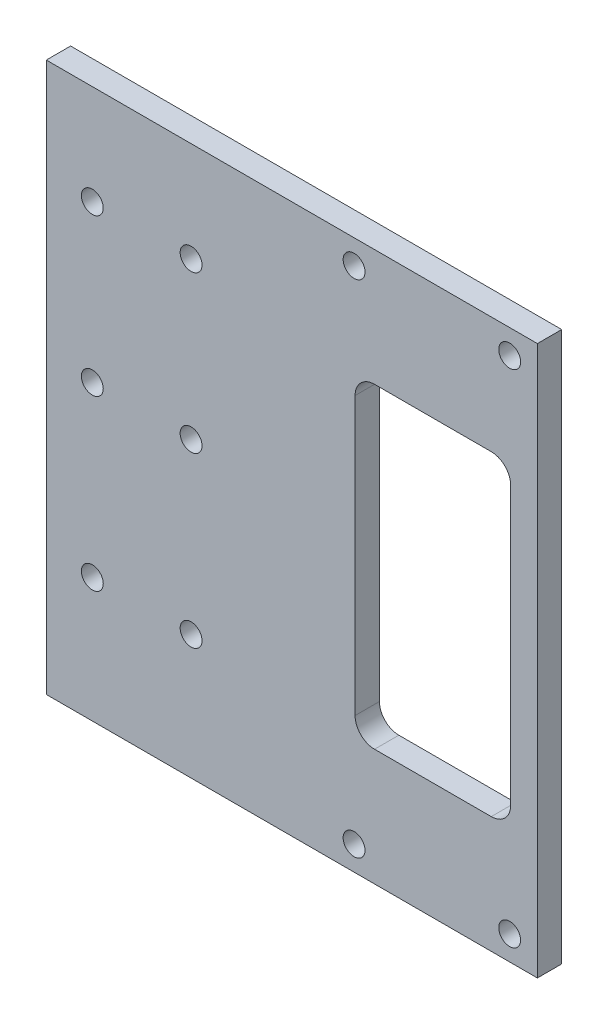
ISO-10303-21;
HEADER;
FILE_DESCRIPTION(('STEP AP214'),'2;1');
FILE_NAME('part.step','',(''),(''),'','','');
FILE_SCHEMA(('AUTOMOTIVE_DESIGN { 1 0 10303 214 1 1 1 1 }'));
ENDSEC;
DATA;
#1=APPLICATION_CONTEXT('core data for automotive mechanical design processes');
#2=APPLICATION_PROTOCOL_DEFINITION('international standard','automotive_design',2000,#1);
#3=PRODUCT_CONTEXT('',#1,'mechanical');
#4=PRODUCT('Part','Part','',(#3));
#5=PRODUCT_RELATED_PRODUCT_CATEGORY('part','',(#4));
#6=PRODUCT_DEFINITION_FORMATION('','',#4);
#7=PRODUCT_DEFINITION_CONTEXT('part definition',#1,'design');
#8=PRODUCT_DEFINITION('design','',#6,#7);
#9=PRODUCT_DEFINITION_SHAPE('','',#8);
#10=(LENGTH_UNIT() NAMED_UNIT(*) SI_UNIT(.MILLI.,.METRE.));
#11=(NAMED_UNIT(*) PLANE_ANGLE_UNIT() SI_UNIT($,.RADIAN.));
#12=(NAMED_UNIT(*) SI_UNIT($,.STERADIAN.) SOLID_ANGLE_UNIT());
#13=UNCERTAINTY_MEASURE_WITH_UNIT(LENGTH_MEASURE(1.E-05),#10,'distance_accuracy_value','');
#14=(GEOMETRIC_REPRESENTATION_CONTEXT(3) GLOBAL_UNCERTAINTY_ASSIGNED_CONTEXT((#13)) GLOBAL_UNIT_ASSIGNED_CONTEXT((#10,
#11,#12)) REPRESENTATION_CONTEXT('',''));
#15=CARTESIAN_POINT('',(0.,0.,0.));
#16=DIRECTION('',(0.,0.,1.));
#17=DIRECTION('',(1.,0.,0.));
#18=AXIS2_PLACEMENT_3D('',#15,#16,#17);
#19=CARTESIAN_POINT('',(50.5,-56.5,5.));
#20=DIRECTION('',(-1.,0.,0.));
#21=DIRECTION('',(0.,0.,1.));
#22=AXIS2_PLACEMENT_3D('',#19,#20,#21);
#23=PLANE('',#22);
#24=DIRECTION('',(0.,1.,0.));
#25=VECTOR('',#24,1.);
#26=CARTESIAN_POINT('',(50.5,-56.5,0.));
#27=LINE('',#26,#25);
#28=CARTESIAN_POINT('',(50.5,-56.5,0.));
#29=VERTEX_POINT('',#28);
#30=CARTESIAN_POINT('',(50.5,56.5,0.));
#31=VERTEX_POINT('',#30);
#32=EDGE_CURVE('E249',#29,#31,#27,.T.);
#33=ORIENTED_EDGE('',*,*,#32,.T.);
#34=DIRECTION('',(0.,0.,-1.));
#35=VECTOR('',#34,1.);
#36=CARTESIAN_POINT('',(50.5,56.5,5.));
#37=LINE('',#36,#35);
#38=CARTESIAN_POINT('',(50.5,56.5,5.));
#39=VERTEX_POINT('',#38);
#40=EDGE_CURVE('E11',#39,#31,#37,.T.);
#41=ORIENTED_EDGE('',*,*,#40,.F.);
#42=DIRECTION('',(0.,1.,0.));
#43=VECTOR('',#42,1.);
#44=CARTESIAN_POINT('',(50.5,-56.5,5.));
#45=LINE('',#44,#43);
#46=CARTESIAN_POINT('',(50.5,-56.5,5.));
#47=VERTEX_POINT('',#46);
#48=EDGE_CURVE('E250',#47,#39,#45,.T.);
#49=ORIENTED_EDGE('',*,*,#48,.F.);
#50=DIRECTION('',(0.,0.,-1.));
#51=VECTOR('',#50,1.);
#52=CARTESIAN_POINT('',(50.5,-56.5,5.));
#53=LINE('',#52,#51);
#54=EDGE_CURVE('E260',#47,#29,#53,.T.);
#55=ORIENTED_EDGE('',*,*,#54,.T.);
#56=EDGE_LOOP('',(#33,#41,#49,#55));
#57=FACE_BOUND('',#56,.T.);
#58=ADVANCED_FACE('F33',(#57),#23,.F.);
#59=CARTESIAN_POINT('',(-50.5,56.5,5.));
#60=DIRECTION('',(0.,-1.,0.));
#61=DIRECTION('',(0.,0.,-1.));
#62=AXIS2_PLACEMENT_3D('',#59,#60,#61);
#63=PLANE('',#62);
#64=DIRECTION('',(-1.,0.,0.));
#65=VECTOR('',#64,1.);
#66=CARTESIAN_POINT('',(-50.5,56.5,0.));
#67=LINE('',#66,#65);
#68=CARTESIAN_POINT('',(-50.5,56.5,0.));
#69=VERTEX_POINT('',#68);
#70=EDGE_CURVE('E263',#31,#69,#67,.T.);
#71=ORIENTED_EDGE('',*,*,#70,.T.);
#72=DIRECTION('',(0.,0.,-1.));
#73=VECTOR('',#72,1.);
#74=CARTESIAN_POINT('',(-50.5,56.5,5.));
#75=LINE('',#74,#73);
#76=CARTESIAN_POINT('',(-50.5,56.5,5.));
#77=VERTEX_POINT('',#76);
#78=EDGE_CURVE('E40',#77,#69,#75,.T.);
#79=ORIENTED_EDGE('',*,*,#78,.F.);
#80=DIRECTION('',(-1.,0.,0.));
#81=VECTOR('',#80,1.);
#82=CARTESIAN_POINT('',(-50.5,56.5,5.));
#83=LINE('',#82,#81);
#84=EDGE_CURVE('E253',#39,#77,#83,.T.);
#85=ORIENTED_EDGE('',*,*,#84,.F.);
#86=ORIENTED_EDGE('',*,*,#40,.T.);
#87=EDGE_LOOP('',(#71,#79,#85,#86));
#88=FACE_BOUND('',#87,.T.);
#89=ADVANCED_FACE('F292',(#88),#63,.F.);
#90=CARTESIAN_POINT('',(-50.5,-56.5,5.));
#91=DIRECTION('',(1.,0.,0.));
#92=DIRECTION('',(0.,0.,-1.));
#93=AXIS2_PLACEMENT_3D('',#90,#91,#92);
#94=PLANE('',#93);
#95=DIRECTION('',(0.,-1.,0.));
#96=VECTOR('',#95,1.);
#97=CARTESIAN_POINT('',(-50.5,-56.5,0.));
#98=LINE('',#97,#96);
#99=CARTESIAN_POINT('',(-50.5,-56.5,0.));
#100=VERTEX_POINT('',#99);
#101=EDGE_CURVE('E265',#69,#100,#98,.T.);
#102=ORIENTED_EDGE('',*,*,#101,.T.);
#103=DIRECTION('',(0.,0.,-1.));
#104=VECTOR('',#103,1.);
#105=CARTESIAN_POINT('',(-50.5,-56.5,5.));
#106=LINE('',#105,#104);
#107=CARTESIAN_POINT('',(-50.5,-56.5,5.));
#108=VERTEX_POINT('',#107);
#109=EDGE_CURVE('E270',#108,#100,#106,.T.);
#110=ORIENTED_EDGE('',*,*,#109,.F.);
#111=DIRECTION('',(0.,-1.,0.));
#112=VECTOR('',#111,1.);
#113=CARTESIAN_POINT('',(-50.5,-56.5,5.));
#114=LINE('',#113,#112);
#115=EDGE_CURVE('E256',#77,#108,#114,.T.);
#116=ORIENTED_EDGE('',*,*,#115,.F.);
#117=ORIENTED_EDGE('',*,*,#78,.T.);
#118=EDGE_LOOP('',(#102,#110,#116,#117));
#119=FACE_BOUND('',#118,.T.);
#120=ADVANCED_FACE('F277',(#119),#94,.F.);
#121=CARTESIAN_POINT('',(-50.5,-56.5,5.));
#122=DIRECTION('',(0.,1.,0.));
#123=DIRECTION('',(0.,0.,1.));
#124=AXIS2_PLACEMENT_3D('',#121,#122,#123);
#125=PLANE('',#124);
#126=DIRECTION('',(1.,0.,0.));
#127=VECTOR('',#126,1.);
#128=CARTESIAN_POINT('',(-50.5,-56.5,0.));
#129=LINE('',#128,#127);
#130=EDGE_CURVE('E254',#100,#29,#129,.T.);
#131=ORIENTED_EDGE('',*,*,#130,.T.);
#132=ORIENTED_EDGE('',*,*,#54,.F.);
#133=DIRECTION('',(1.,0.,0.));
#134=VECTOR('',#133,1.);
#135=CARTESIAN_POINT('',(-50.5,-56.5,5.));
#136=LINE('',#135,#134);
#137=EDGE_CURVE('E258',#108,#47,#136,.T.);
#138=ORIENTED_EDGE('',*,*,#137,.F.);
#139=ORIENTED_EDGE('',*,*,#109,.T.);
#140=EDGE_LOOP('',(#131,#132,#138,#139));
#141=FACE_BOUND('',#140,.T.);
#142=ADVANCED_FACE('F285',(#141),#125,.F.);
#143=CARTESIAN_POINT('',(0.,0.,5.));
#144=DIRECTION('',(0.,0.,-1.));
#145=DIRECTION('',(-1.,0.,0.));
#146=AXIS2_PLACEMENT_3D('',#143,#144,#145);
#147=PLANE('',#146);
#148=DIRECTION('',(0.,-1.,0.));
#149=VECTOR('',#148,1.);
#150=CARTESIAN_POINT('',(13.0083412949951,28.5,5.));
#151=LINE('',#150,#149);
#152=CARTESIAN_POINT('',(13.0083412949951,28.5,5.));
#153=VERTEX_POINT('',#152);
#154=CARTESIAN_POINT('',(13.0083412949951,-28.5,5.));
#155=VERTEX_POINT('',#154);
#156=EDGE_CURVE('E160',#153,#155,#151,.T.);
#157=ORIENTED_EDGE('',*,*,#156,.F.);
#158=CARTESIAN_POINT('',(17.0083412949951,28.5,5.));
#159=DIRECTION('',(0.,0.,1.));
#160=DIRECTION('',(-1.,0.,0.));
#161=AXIS2_PLACEMENT_3D('',#158,#159,#160);
#162=CIRCLE('',#161,4.);
#163=CARTESIAN_POINT('',(17.0083412949951,32.5,5.));
#164=VERTEX_POINT('',#163);
#165=EDGE_CURVE('E47',#164,#153,#162,.T.);
#166=ORIENTED_EDGE('',*,*,#165,.F.);
#167=DIRECTION('',(-1.,0.,0.));
#168=VECTOR('',#167,1.);
#169=CARTESIAN_POINT('',(41.0083412949951,32.5,5.));
#170=LINE('',#169,#168);
#171=CARTESIAN_POINT('',(41.0083412949951,32.5,5.));
#172=VERTEX_POINT('',#171);
#173=EDGE_CURVE('E140',#172,#164,#170,.T.);
#174=ORIENTED_EDGE('',*,*,#173,.F.);
#175=CARTESIAN_POINT('',(41.0083412949951,28.5,5.));
#176=DIRECTION('',(0.,0.,1.));
#177=DIRECTION('',(-1.,0.,0.));
#178=AXIS2_PLACEMENT_3D('',#175,#176,#177);
#179=CIRCLE('',#178,4.);
#180=CARTESIAN_POINT('',(45.0083412949951,28.5,5.));
#181=VERTEX_POINT('',#180);
#182=EDGE_CURVE('E143',#181,#172,#179,.T.);
#183=ORIENTED_EDGE('',*,*,#182,.F.);
#184=DIRECTION('',(0.,1.,0.));
#185=VECTOR('',#184,1.);
#186=CARTESIAN_POINT('',(45.0083412949951,28.5,5.));
#187=LINE('',#186,#185);
#188=CARTESIAN_POINT('',(45.0083412949951,-28.5,5.));
#189=VERTEX_POINT('',#188);
#190=EDGE_CURVE('E171',#189,#181,#187,.T.);
#191=ORIENTED_EDGE('',*,*,#190,.F.);
#192=CARTESIAN_POINT('',(41.0083412949951,-28.5,5.));
#193=DIRECTION('',(0.,0.,1.));
#194=DIRECTION('',(1.,0.,0.));
#195=AXIS2_PLACEMENT_3D('',#192,#193,#194);
#196=CIRCLE('',#195,4.);
#197=CARTESIAN_POINT('',(41.0083412949951,-32.5,5.));
#198=VERTEX_POINT('',#197);
#199=EDGE_CURVE('E168',#198,#189,#196,.T.);
#200=ORIENTED_EDGE('',*,*,#199,.F.);
#201=DIRECTION('',(1.,0.,0.));
#202=VECTOR('',#201,1.);
#203=CARTESIAN_POINT('',(41.0083412949951,-32.5,5.));
#204=LINE('',#203,#202);
#205=CARTESIAN_POINT('',(17.0083412949951,-32.5,5.));
#206=VERTEX_POINT('',#205);
#207=EDGE_CURVE('E165',#206,#198,#204,.T.);
#208=ORIENTED_EDGE('',*,*,#207,.F.);
#209=CARTESIAN_POINT('',(17.0083412949951,-28.5,5.));
#210=DIRECTION('',(0.,0.,1.));
#211=DIRECTION('',(1.,0.,0.));
#212=AXIS2_PLACEMENT_3D('',#209,#210,#211);
#213=CIRCLE('',#212,4.);
#214=EDGE_CURVE('E162',#155,#206,#213,.T.);
#215=ORIENTED_EDGE('',*,*,#214,.F.);
#216=EDGE_LOOP('',(#157,#166,#174,#183,#191,#200,#208,#215));
#217=FACE_BOUND('',#216,.T.);
#218=CARTESIAN_POINT('',(44.8000000000001,51.4999999999999,5.));
#219=DIRECTION('',(0.,0.,1.));
#220=DIRECTION('',(1.,0.,0.));
#221=AXIS2_PLACEMENT_3D('',#218,#219,#220);
#222=CIRCLE('',#221,2.25);
#223=CARTESIAN_POINT('',(47.0500000000001,51.4999999999999,5.));
#224=VERTEX_POINT('',#223);
#225=EDGE_CURVE('E178',#224,#224,#222,.T.);
#226=ORIENTED_EDGE('',*,*,#225,.F.);
#227=EDGE_LOOP('',(#226));
#228=FACE_BOUND('',#227,.T.);
#229=CARTESIAN_POINT('',(12.8000000000001,51.4999999999999,5.));
#230=DIRECTION('',(0.,0.,1.));
#231=DIRECTION('',(1.,0.,0.));
#232=AXIS2_PLACEMENT_3D('',#229,#230,#231);
#233=CIRCLE('',#232,2.25);
#234=CARTESIAN_POINT('',(15.0500000000001,51.4999999999999,5.));
#235=VERTEX_POINT('',#234);
#236=EDGE_CURVE('E195',#235,#235,#233,.T.);
#237=ORIENTED_EDGE('',*,*,#236,.F.);
#238=EDGE_LOOP('',(#237));
#239=FACE_BOUND('',#238,.T.);
#240=CARTESIAN_POINT('',(12.8000000000001,-51.5,5.));
#241=DIRECTION('',(0.,0.,1.));
#242=DIRECTION('',(1.,0.,0.));
#243=AXIS2_PLACEMENT_3D('',#240,#241,#242);
#244=CIRCLE('',#243,2.25);
#245=CARTESIAN_POINT('',(15.0500000000001,-51.5,5.));
#246=VERTEX_POINT('',#245);
#247=EDGE_CURVE('E201',#246,#246,#244,.T.);
#248=ORIENTED_EDGE('',*,*,#247,.F.);
#249=EDGE_LOOP('',(#248));
#250=FACE_BOUND('',#249,.T.);
#251=CARTESIAN_POINT('',(44.8000000000001,-51.5,5.));
#252=DIRECTION('',(0.,0.,1.));
#253=DIRECTION('',(1.,0.,0.));
#254=AXIS2_PLACEMENT_3D('',#251,#252,#253);
#255=CIRCLE('',#254,2.25);
#256=CARTESIAN_POINT('',(47.0500000000001,-51.5,5.));
#257=VERTEX_POINT('',#256);
#258=EDGE_CURVE('E207',#257,#257,#255,.T.);
#259=ORIENTED_EDGE('',*,*,#258,.F.);
#260=EDGE_LOOP('',(#259));
#261=FACE_BOUND('',#260,.T.);
#262=CARTESIAN_POINT('',(-20.7231298925779,-30.9129397601859,5.));
#263=DIRECTION('',(0.,0.,1.));
#264=DIRECTION('',(1.,0.,0.));
#265=AXIS2_PLACEMENT_3D('',#262,#263,#264);
#266=CIRCLE('',#265,2.24999999999999);
#267=CARTESIAN_POINT('',(-18.4731298925779,-30.9129397601859,5.));
#268=VERTEX_POINT('',#267);
#269=EDGE_CURVE('E213',#268,#268,#266,.T.);
#270=ORIENTED_EDGE('',*,*,#269,.F.);
#271=EDGE_LOOP('',(#270));
#272=FACE_BOUND('',#271,.T.);
#273=CARTESIAN_POINT('',(-20.7231298925779,3.80346419902011,5.));
#274=DIRECTION('',(0.,0.,1.));
#275=DIRECTION('',(1.,0.,0.));
#276=AXIS2_PLACEMENT_3D('',#273,#274,#275);
#277=CIRCLE('',#276,2.24999999999999);
#278=CARTESIAN_POINT('',(-18.4731298925779,3.80346419902011,5.));
#279=VERTEX_POINT('',#278);
#280=EDGE_CURVE('E219',#279,#279,#277,.T.);
#281=ORIENTED_EDGE('',*,*,#280,.F.);
#282=EDGE_LOOP('',(#281));
#283=FACE_BOUND('',#282,.T.);
#284=CARTESIAN_POINT('',(-41.0358215426072,3.80346419902011,5.));
#285=DIRECTION('',(0.,0.,1.));
#286=DIRECTION('',(1.,0.,0.));
#287=AXIS2_PLACEMENT_3D('',#284,#285,#286);
#288=CIRCLE('',#287,2.24999999999999);
#289=CARTESIAN_POINT('',(-38.7858215426072,3.80346419902011,5.));
#290=VERTEX_POINT('',#289);
#291=EDGE_CURVE('E225',#290,#290,#288,.T.);
#292=ORIENTED_EDGE('',*,*,#291,.F.);
#293=EDGE_LOOP('',(#292));
#294=FACE_BOUND('',#293,.T.);
#295=CARTESIAN_POINT('',(-41.0358215426072,-30.9129397601859,5.));
#296=DIRECTION('',(0.,0.,1.));
#297=DIRECTION('',(1.,0.,0.));
#298=AXIS2_PLACEMENT_3D('',#295,#296,#297);
#299=CIRCLE('',#298,2.24999999999999);
#300=CARTESIAN_POINT('',(-38.7858215426072,-30.9129397601859,5.));
#301=VERTEX_POINT('',#300);
#302=EDGE_CURVE('E231',#301,#301,#299,.T.);
#303=ORIENTED_EDGE('',*,*,#302,.F.);
#304=EDGE_LOOP('',(#303));
#305=FACE_BOUND('',#304,.T.);
#306=CARTESIAN_POINT('',(-41.0358215426072,35.9837671610475,5.));
#307=DIRECTION('',(0.,0.,1.));
#308=DIRECTION('',(1.,0.,0.));
#309=AXIS2_PLACEMENT_3D('',#306,#307,#308);
#310=CIRCLE('',#309,2.24999999999999);
#311=CARTESIAN_POINT('',(-38.7858215426072,35.9837671610475,5.));
#312=VERTEX_POINT('',#311);
#313=EDGE_CURVE('E237',#312,#312,#310,.T.);
#314=ORIENTED_EDGE('',*,*,#313,.F.);
#315=EDGE_LOOP('',(#314));
#316=FACE_BOUND('',#315,.T.);
#317=CARTESIAN_POINT('',(-20.7231298925779,35.9837671610475,5.));
#318=DIRECTION('',(0.,0.,1.));
#319=DIRECTION('',(1.,0.,0.));
#320=AXIS2_PLACEMENT_3D('',#317,#318,#319);
#321=CIRCLE('',#320,2.24999999999999);
#322=CARTESIAN_POINT('',(-18.4731298925779,35.9837671610475,5.));
#323=VERTEX_POINT('',#322);
#324=EDGE_CURVE('E243',#323,#323,#321,.T.);
#325=ORIENTED_EDGE('',*,*,#324,.F.);
#326=EDGE_LOOP('',(#325));
#327=FACE_BOUND('',#326,.T.);
#328=ORIENTED_EDGE('',*,*,#48,.T.);
#329=ORIENTED_EDGE('',*,*,#84,.T.);
#330=ORIENTED_EDGE('',*,*,#115,.T.);
#331=ORIENTED_EDGE('',*,*,#137,.T.);
#332=EDGE_LOOP('',(#328,#329,#330,#331));
#333=FACE_BOUND('',#332,.T.);
#334=ADVANCED_FACE('F291',(#217,#228,#239,#250,#261,#272,#283,#294,#305,#316,#327,#333),#147,.F.);
#335=CARTESIAN_POINT('',(0.,0.,0.));
#336=DIRECTION('',(0.,0.,-1.));
#337=DIRECTION('',(-1.,0.,0.));
#338=AXIS2_PLACEMENT_3D('',#335,#336,#337);
#339=PLANE('',#338);
#340=CARTESIAN_POINT('',(17.0083412949951,28.5,0.));
#341=DIRECTION('',(0.,0.,1.));
#342=DIRECTION('',(-1.,0.,0.));
#343=AXIS2_PLACEMENT_3D('',#340,#341,#342);
#344=CIRCLE('',#343,4.);
#345=CARTESIAN_POINT('',(17.0083412949951,32.5,0.));
#346=VERTEX_POINT('',#345);
#347=CARTESIAN_POINT('',(13.0083412949951,28.5,0.));
#348=VERTEX_POINT('',#347);
#349=EDGE_CURVE('E123',#346,#348,#344,.T.);
#350=ORIENTED_EDGE('',*,*,#349,.T.);
#351=DIRECTION('',(0.,-1.,0.));
#352=VECTOR('',#351,1.);
#353=CARTESIAN_POINT('',(13.0083412949951,28.5,0.));
#354=LINE('',#353,#352);
#355=CARTESIAN_POINT('',(13.0083412949951,-28.5,0.));
#356=VERTEX_POINT('',#355);
#357=EDGE_CURVE('E132',#348,#356,#354,.T.);
#358=ORIENTED_EDGE('',*,*,#357,.T.);
#359=CARTESIAN_POINT('',(17.0083412949951,-28.5,0.));
#360=DIRECTION('',(0.,0.,1.));
#361=DIRECTION('',(1.,0.,0.));
#362=AXIS2_PLACEMENT_3D('',#359,#360,#361);
#363=CIRCLE('',#362,4.);
#364=CARTESIAN_POINT('',(17.0083412949951,-32.5,0.));
#365=VERTEX_POINT('',#364);
#366=EDGE_CURVE('E55',#356,#365,#363,.T.);
#367=ORIENTED_EDGE('',*,*,#366,.T.);
#368=DIRECTION('',(1.,0.,0.));
#369=VECTOR('',#368,1.);
#370=CARTESIAN_POINT('',(41.0083412949951,-32.5,0.));
#371=LINE('',#370,#369);
#372=CARTESIAN_POINT('',(41.0083412949951,-32.5,0.));
#373=VERTEX_POINT('',#372);
#374=EDGE_CURVE('E147',#365,#373,#371,.T.);
#375=ORIENTED_EDGE('',*,*,#374,.T.);
#376=CARTESIAN_POINT('',(41.0083412949951,-28.5,0.));
#377=DIRECTION('',(0.,0.,1.));
#378=DIRECTION('',(1.,0.,0.));
#379=AXIS2_PLACEMENT_3D('',#376,#377,#378);
#380=CIRCLE('',#379,4.);
#381=CARTESIAN_POINT('',(45.0083412949951,-28.5,0.));
#382=VERTEX_POINT('',#381);
#383=EDGE_CURVE('E150',#373,#382,#380,.T.);
#384=ORIENTED_EDGE('',*,*,#383,.T.);
#385=DIRECTION('',(0.,1.,0.));
#386=VECTOR('',#385,1.);
#387=CARTESIAN_POINT('',(45.0083412949951,28.5,0.));
#388=LINE('',#387,#386);
#389=CARTESIAN_POINT('',(45.0083412949951,28.5,0.));
#390=VERTEX_POINT('',#389);
#391=EDGE_CURVE('E153',#382,#390,#388,.T.);
#392=ORIENTED_EDGE('',*,*,#391,.T.);
#393=CARTESIAN_POINT('',(41.0083412949951,28.5,0.));
#394=DIRECTION('',(0.,0.,1.));
#395=DIRECTION('',(-1.,0.,0.));
#396=AXIS2_PLACEMENT_3D('',#393,#394,#395);
#397=CIRCLE('',#396,4.);
#398=CARTESIAN_POINT('',(41.0083412949951,32.5,0.));
#399=VERTEX_POINT('',#398);
#400=EDGE_CURVE('E156',#390,#399,#397,.T.);
#401=ORIENTED_EDGE('',*,*,#400,.T.);
#402=DIRECTION('',(-1.,0.,0.));
#403=VECTOR('',#402,1.);
#404=CARTESIAN_POINT('',(41.0083412949951,32.5,0.));
#405=LINE('',#404,#403);
#406=EDGE_CURVE('E129',#399,#346,#405,.T.);
#407=ORIENTED_EDGE('',*,*,#406,.T.);
#408=EDGE_LOOP('',(#350,#358,#367,#375,#384,#392,#401,#407));
#409=FACE_BOUND('',#408,.T.);
#410=CARTESIAN_POINT('',(44.8000000000001,51.4999999999999,0.));
#411=DIRECTION('',(0.,0.,1.));
#412=DIRECTION('',(1.,0.,0.));
#413=AXIS2_PLACEMENT_3D('',#410,#411,#412);
#414=CIRCLE('',#413,2.25);
#415=CARTESIAN_POINT('',(47.0500000000001,51.4999999999999,0.));
#416=VERTEX_POINT('',#415);
#417=EDGE_CURVE('E192',#416,#416,#414,.T.);
#418=ORIENTED_EDGE('',*,*,#417,.T.);
#419=EDGE_LOOP('',(#418));
#420=FACE_BOUND('',#419,.T.);
#421=CARTESIAN_POINT('',(12.8000000000001,51.4999999999999,0.));
#422=DIRECTION('',(0.,0.,1.));
#423=DIRECTION('',(1.,0.,0.));
#424=AXIS2_PLACEMENT_3D('',#421,#422,#423);
#425=CIRCLE('',#424,2.25);
#426=CARTESIAN_POINT('',(15.0500000000001,51.4999999999999,0.));
#427=VERTEX_POINT('',#426);
#428=EDGE_CURVE('E198',#427,#427,#425,.T.);
#429=ORIENTED_EDGE('',*,*,#428,.T.);
#430=EDGE_LOOP('',(#429));
#431=FACE_BOUND('',#430,.T.);
#432=CARTESIAN_POINT('',(12.8000000000001,-51.5,0.));
#433=DIRECTION('',(0.,0.,1.));
#434=DIRECTION('',(1.,0.,0.));
#435=AXIS2_PLACEMENT_3D('',#432,#433,#434);
#436=CIRCLE('',#435,2.25);
#437=CARTESIAN_POINT('',(15.0500000000001,-51.5,0.));
#438=VERTEX_POINT('',#437);
#439=EDGE_CURVE('E204',#438,#438,#436,.T.);
#440=ORIENTED_EDGE('',*,*,#439,.T.);
#441=EDGE_LOOP('',(#440));
#442=FACE_BOUND('',#441,.T.);
#443=CARTESIAN_POINT('',(44.8000000000001,-51.5,0.));
#444=DIRECTION('',(0.,0.,1.));
#445=DIRECTION('',(1.,0.,0.));
#446=AXIS2_PLACEMENT_3D('',#443,#444,#445);
#447=CIRCLE('',#446,2.25);
#448=CARTESIAN_POINT('',(47.0500000000001,-51.5,0.));
#449=VERTEX_POINT('',#448);
#450=EDGE_CURVE('E210',#449,#449,#447,.T.);
#451=ORIENTED_EDGE('',*,*,#450,.T.);
#452=EDGE_LOOP('',(#451));
#453=FACE_BOUND('',#452,.T.);
#454=CARTESIAN_POINT('',(-20.7231298925779,-30.9129397601859,0.));
#455=DIRECTION('',(0.,0.,1.));
#456=DIRECTION('',(1.,0.,0.));
#457=AXIS2_PLACEMENT_3D('',#454,#455,#456);
#458=CIRCLE('',#457,2.25);
#459=CARTESIAN_POINT('',(-18.4731298925779,-30.9129397601859,0.));
#460=VERTEX_POINT('',#459);
#461=EDGE_CURVE('E216',#460,#460,#458,.T.);
#462=ORIENTED_EDGE('',*,*,#461,.T.);
#463=EDGE_LOOP('',(#462));
#464=FACE_BOUND('',#463,.T.);
#465=CARTESIAN_POINT('',(-20.7231298925779,3.80346419902011,0.));
#466=DIRECTION('',(0.,0.,1.));
#467=DIRECTION('',(1.,0.,0.));
#468=AXIS2_PLACEMENT_3D('',#465,#466,#467);
#469=CIRCLE('',#468,2.25);
#470=CARTESIAN_POINT('',(-18.4731298925779,3.80346419902011,0.));
#471=VERTEX_POINT('',#470);
#472=EDGE_CURVE('E222',#471,#471,#469,.T.);
#473=ORIENTED_EDGE('',*,*,#472,.T.);
#474=EDGE_LOOP('',(#473));
#475=FACE_BOUND('',#474,.T.);
#476=CARTESIAN_POINT('',(-41.0358215426072,3.80346419902011,0.));
#477=DIRECTION('',(0.,0.,1.));
#478=DIRECTION('',(1.,0.,0.));
#479=AXIS2_PLACEMENT_3D('',#476,#477,#478);
#480=CIRCLE('',#479,2.25);
#481=CARTESIAN_POINT('',(-38.7858215426072,3.80346419902011,0.));
#482=VERTEX_POINT('',#481);
#483=EDGE_CURVE('E228',#482,#482,#480,.T.);
#484=ORIENTED_EDGE('',*,*,#483,.T.);
#485=EDGE_LOOP('',(#484));
#486=FACE_BOUND('',#485,.T.);
#487=CARTESIAN_POINT('',(-41.0358215426072,-30.9129397601859,0.));
#488=DIRECTION('',(0.,0.,1.));
#489=DIRECTION('',(1.,0.,0.));
#490=AXIS2_PLACEMENT_3D('',#487,#488,#489);
#491=CIRCLE('',#490,2.25);
#492=CARTESIAN_POINT('',(-38.7858215426072,-30.9129397601859,0.));
#493=VERTEX_POINT('',#492);
#494=EDGE_CURVE('E234',#493,#493,#491,.T.);
#495=ORIENTED_EDGE('',*,*,#494,.T.);
#496=EDGE_LOOP('',(#495));
#497=FACE_BOUND('',#496,.T.);
#498=CARTESIAN_POINT('',(-41.0358215426072,35.9837671610475,0.));
#499=DIRECTION('',(0.,0.,1.));
#500=DIRECTION('',(1.,0.,0.));
#501=AXIS2_PLACEMENT_3D('',#498,#499,#500);
#502=CIRCLE('',#501,2.25);
#503=CARTESIAN_POINT('',(-38.7858215426072,35.9837671610475,0.));
#504=VERTEX_POINT('',#503);
#505=EDGE_CURVE('E240',#504,#504,#502,.T.);
#506=ORIENTED_EDGE('',*,*,#505,.T.);
#507=EDGE_LOOP('',(#506));
#508=FACE_BOUND('',#507,.T.);
#509=CARTESIAN_POINT('',(-20.7231298925779,35.9837671610475,0.));
#510=DIRECTION('',(0.,0.,1.));
#511=DIRECTION('',(1.,0.,0.));
#512=AXIS2_PLACEMENT_3D('',#509,#510,#511);
#513=CIRCLE('',#512,2.25);
#514=CARTESIAN_POINT('',(-18.4731298925779,35.9837671610475,0.));
#515=VERTEX_POINT('',#514);
#516=EDGE_CURVE('E246',#515,#515,#513,.T.);
#517=ORIENTED_EDGE('',*,*,#516,.T.);
#518=EDGE_LOOP('',(#517));
#519=FACE_BOUND('',#518,.T.);
#520=ORIENTED_EDGE('',*,*,#32,.F.);
#521=ORIENTED_EDGE('',*,*,#130,.F.);
#522=ORIENTED_EDGE('',*,*,#101,.F.);
#523=ORIENTED_EDGE('',*,*,#70,.F.);
#524=EDGE_LOOP('',(#520,#521,#522,#523));
#525=FACE_BOUND('',#524,.T.);
#526=ADVANCED_FACE('F136',(#409,#420,#431,#442,#453,#464,#475,#486,#497,#508,#519,#525),#339,.T.);
#527=CARTESIAN_POINT('',(-20.7231298925779,35.9837671610475,5.));
#528=DIRECTION('',(0.,0.,1.));
#529=DIRECTION('',(1.,0.,0.));
#530=AXIS2_PLACEMENT_3D('',#527,#528,#529);
#531=CYLINDRICAL_SURFACE('',#530,2.24999999999999);
#532=ORIENTED_EDGE('',*,*,#516,.F.);
#533=EDGE_LOOP('',(#532));
#534=FACE_BOUND('',#533,.T.);
#535=ORIENTED_EDGE('',*,*,#324,.T.);
#536=EDGE_LOOP('',(#535));
#537=FACE_BOUND('',#536,.T.);
#538=ADVANCED_FACE('F304',(#534,#537),#531,.F.);
#539=CARTESIAN_POINT('',(-41.0358215426072,35.9837671610475,5.));
#540=DIRECTION('',(0.,0.,1.));
#541=DIRECTION('',(1.,0.,0.));
#542=AXIS2_PLACEMENT_3D('',#539,#540,#541);
#543=CYLINDRICAL_SURFACE('',#542,2.25);
#544=ORIENTED_EDGE('',*,*,#505,.F.);
#545=EDGE_LOOP('',(#544));
#546=FACE_BOUND('',#545,.T.);
#547=ORIENTED_EDGE('',*,*,#313,.T.);
#548=EDGE_LOOP('',(#547));
#549=FACE_BOUND('',#548,.T.);
#550=ADVANCED_FACE('F310',(#546,#549),#543,.F.);
#551=CARTESIAN_POINT('',(-41.0358215426072,-30.9129397601859,5.));
#552=DIRECTION('',(0.,0.,1.));
#553=DIRECTION('',(1.,0.,0.));
#554=AXIS2_PLACEMENT_3D('',#551,#552,#553);
#555=CYLINDRICAL_SURFACE('',#554,2.25);
#556=ORIENTED_EDGE('',*,*,#494,.F.);
#557=EDGE_LOOP('',(#556));
#558=FACE_BOUND('',#557,.T.);
#559=ORIENTED_EDGE('',*,*,#302,.T.);
#560=EDGE_LOOP('',(#559));
#561=FACE_BOUND('',#560,.T.);
#562=ADVANCED_FACE('F314',(#558,#561),#555,.F.);
#563=CARTESIAN_POINT('',(-41.0358215426072,3.80346419902011,5.));
#564=DIRECTION('',(0.,0.,1.));
#565=DIRECTION('',(1.,0.,0.));
#566=AXIS2_PLACEMENT_3D('',#563,#564,#565);
#567=CYLINDRICAL_SURFACE('',#566,2.25);
#568=ORIENTED_EDGE('',*,*,#483,.F.);
#569=EDGE_LOOP('',(#568));
#570=FACE_BOUND('',#569,.T.);
#571=ORIENTED_EDGE('',*,*,#291,.T.);
#572=EDGE_LOOP('',(#571));
#573=FACE_BOUND('',#572,.T.);
#574=ADVANCED_FACE('F318',(#570,#573),#567,.F.);
#575=CARTESIAN_POINT('',(-20.7231298925779,3.80346419902011,5.));
#576=DIRECTION('',(0.,0.,1.));
#577=DIRECTION('',(1.,0.,0.));
#578=AXIS2_PLACEMENT_3D('',#575,#576,#577);
#579=CYLINDRICAL_SURFACE('',#578,2.24999999999999);
#580=ORIENTED_EDGE('',*,*,#472,.F.);
#581=EDGE_LOOP('',(#580));
#582=FACE_BOUND('',#581,.T.);
#583=ORIENTED_EDGE('',*,*,#280,.T.);
#584=EDGE_LOOP('',(#583));
#585=FACE_BOUND('',#584,.T.);
#586=ADVANCED_FACE('F322',(#582,#585),#579,.F.);
#587=CARTESIAN_POINT('',(-20.7231298925779,-30.9129397601859,5.));
#588=DIRECTION('',(0.,0.,1.));
#589=DIRECTION('',(1.,0.,0.));
#590=AXIS2_PLACEMENT_3D('',#587,#588,#589);
#591=CYLINDRICAL_SURFACE('',#590,2.24999999999999);
#592=ORIENTED_EDGE('',*,*,#461,.F.);
#593=EDGE_LOOP('',(#592));
#594=FACE_BOUND('',#593,.T.);
#595=ORIENTED_EDGE('',*,*,#269,.T.);
#596=EDGE_LOOP('',(#595));
#597=FACE_BOUND('',#596,.T.);
#598=ADVANCED_FACE('F326',(#594,#597),#591,.F.);
#599=CARTESIAN_POINT('',(44.8000000000001,-51.5,5.));
#600=DIRECTION('',(0.,0.,1.));
#601=DIRECTION('',(1.,0.,0.));
#602=AXIS2_PLACEMENT_3D('',#599,#600,#601);
#603=CYLINDRICAL_SURFACE('',#602,2.25);
#604=ORIENTED_EDGE('',*,*,#450,.F.);
#605=EDGE_LOOP('',(#604));
#606=FACE_BOUND('',#605,.T.);
#607=ORIENTED_EDGE('',*,*,#258,.T.);
#608=EDGE_LOOP('',(#607));
#609=FACE_BOUND('',#608,.T.);
#610=ADVANCED_FACE('F330',(#606,#609),#603,.F.);
#611=CARTESIAN_POINT('',(12.8000000000001,-51.5,5.));
#612=DIRECTION('',(0.,0.,1.));
#613=DIRECTION('',(1.,0.,0.));
#614=AXIS2_PLACEMENT_3D('',#611,#612,#613);
#615=CYLINDRICAL_SURFACE('',#614,2.25);
#616=ORIENTED_EDGE('',*,*,#439,.F.);
#617=EDGE_LOOP('',(#616));
#618=FACE_BOUND('',#617,.T.);
#619=ORIENTED_EDGE('',*,*,#247,.T.);
#620=EDGE_LOOP('',(#619));
#621=FACE_BOUND('',#620,.T.);
#622=ADVANCED_FACE('F334',(#618,#621),#615,.F.);
#623=CARTESIAN_POINT('',(12.8000000000001,51.4999999999999,5.));
#624=DIRECTION('',(0.,0.,1.));
#625=DIRECTION('',(1.,0.,0.));
#626=AXIS2_PLACEMENT_3D('',#623,#624,#625);
#627=CYLINDRICAL_SURFACE('',#626,2.25);
#628=ORIENTED_EDGE('',*,*,#428,.F.);
#629=EDGE_LOOP('',(#628));
#630=FACE_BOUND('',#629,.T.);
#631=ORIENTED_EDGE('',*,*,#236,.T.);
#632=EDGE_LOOP('',(#631));
#633=FACE_BOUND('',#632,.T.);
#634=ADVANCED_FACE('F338',(#630,#633),#627,.F.);
#635=CARTESIAN_POINT('',(44.8000000000001,51.4999999999999,5.));
#636=DIRECTION('',(0.,0.,1.));
#637=DIRECTION('',(1.,0.,0.));
#638=AXIS2_PLACEMENT_3D('',#635,#636,#637);
#639=CYLINDRICAL_SURFACE('',#638,2.25);
#640=ORIENTED_EDGE('',*,*,#417,.F.);
#641=EDGE_LOOP('',(#640));
#642=FACE_BOUND('',#641,.T.);
#643=ORIENTED_EDGE('',*,*,#225,.T.);
#644=EDGE_LOOP('',(#643));
#645=FACE_BOUND('',#644,.T.);
#646=ADVANCED_FACE('F342',(#642,#645),#639,.F.);
#647=CARTESIAN_POINT('',(17.0083412949951,28.5,0.));
#648=DIRECTION('',(0.,0.,1.));
#649=DIRECTION('',(1.,0.,0.));
#650=AXIS2_PLACEMENT_3D('',#647,#648,#649);
#651=CYLINDRICAL_SURFACE('',#650,4.);
#652=ORIENTED_EDGE('',*,*,#165,.T.);
#653=DIRECTION('',(0.,0.,1.));
#654=VECTOR('',#653,1.);
#655=CARTESIAN_POINT('',(13.0083412949951,28.5,0.));
#656=LINE('',#655,#654);
#657=EDGE_CURVE('E119',#348,#153,#656,.T.);
#658=ORIENTED_EDGE('',*,*,#657,.F.);
#659=ORIENTED_EDGE('',*,*,#349,.F.);
#660=DIRECTION('',(0.,0.,1.));
#661=VECTOR('',#660,1.);
#662=CARTESIAN_POINT('',(17.0083412949951,32.5,0.));
#663=LINE('',#662,#661);
#664=EDGE_CURVE('E176',#346,#164,#663,.T.);
#665=ORIENTED_EDGE('',*,*,#664,.T.);
#666=EDGE_LOOP('',(#652,#658,#659,#665));
#667=FACE_BOUND('',#666,.T.);
#668=ADVANCED_FACE('F121',(#667),#651,.F.);
#669=CARTESIAN_POINT('',(41.0083412949951,32.5,0.));
#670=DIRECTION('',(0.,1.,0.));
#671=DIRECTION('',(-1.,0.,0.));
#672=AXIS2_PLACEMENT_3D('',#669,#670,#671);
#673=PLANE('',#672);
#674=ORIENTED_EDGE('',*,*,#173,.T.);
#675=ORIENTED_EDGE('',*,*,#664,.F.);
#676=ORIENTED_EDGE('',*,*,#406,.F.);
#677=DIRECTION('',(0.,0.,1.));
#678=VECTOR('',#677,1.);
#679=CARTESIAN_POINT('',(41.0083412949951,32.5,0.));
#680=LINE('',#679,#678);
#681=EDGE_CURVE('E179',#399,#172,#680,.T.);
#682=ORIENTED_EDGE('',*,*,#681,.T.);
#683=EDGE_LOOP('',(#674,#675,#676,#682));
#684=FACE_BOUND('',#683,.T.);
#685=ADVANCED_FACE('F349',(#684),#673,.F.);
#686=CARTESIAN_POINT('',(41.0083412949951,28.5,0.));
#687=DIRECTION('',(0.,0.,1.));
#688=DIRECTION('',(1.,0.,0.));
#689=AXIS2_PLACEMENT_3D('',#686,#687,#688);
#690=CYLINDRICAL_SURFACE('',#689,4.);
#691=ORIENTED_EDGE('',*,*,#182,.T.);
#692=ORIENTED_EDGE('',*,*,#681,.F.);
#693=ORIENTED_EDGE('',*,*,#400,.F.);
#694=DIRECTION('',(0.,0.,1.));
#695=VECTOR('',#694,1.);
#696=CARTESIAN_POINT('',(45.0083412949951,28.5,0.));
#697=LINE('',#696,#695);
#698=EDGE_CURVE('E181',#390,#181,#697,.T.);
#699=ORIENTED_EDGE('',*,*,#698,.T.);
#700=EDGE_LOOP('',(#691,#692,#693,#699));
#701=FACE_BOUND('',#700,.T.);
#702=ADVANCED_FACE('F366',(#701),#690,.F.);
#703=CARTESIAN_POINT('',(45.0083412949951,28.5,0.));
#704=DIRECTION('',(1.,0.,0.));
#705=DIRECTION('',(0.,0.,-1.));
#706=AXIS2_PLACEMENT_3D('',#703,#704,#705);
#707=PLANE('',#706);
#708=ORIENTED_EDGE('',*,*,#190,.T.);
#709=ORIENTED_EDGE('',*,*,#698,.F.);
#710=ORIENTED_EDGE('',*,*,#391,.F.);
#711=DIRECTION('',(0.,0.,1.));
#712=VECTOR('',#711,1.);
#713=CARTESIAN_POINT('',(45.0083412949951,-28.5,0.));
#714=LINE('',#713,#712);
#715=EDGE_CURVE('E183',#382,#189,#714,.T.);
#716=ORIENTED_EDGE('',*,*,#715,.T.);
#717=EDGE_LOOP('',(#708,#709,#710,#716));
#718=FACE_BOUND('',#717,.T.);
#719=ADVANCED_FACE('F362',(#718),#707,.F.);
#720=CARTESIAN_POINT('',(41.0083412949951,-28.5,0.));
#721=DIRECTION('',(0.,0.,1.));
#722=DIRECTION('',(1.,0.,0.));
#723=AXIS2_PLACEMENT_3D('',#720,#721,#722);
#724=CYLINDRICAL_SURFACE('',#723,4.);
#725=ORIENTED_EDGE('',*,*,#199,.T.);
#726=ORIENTED_EDGE('',*,*,#715,.F.);
#727=ORIENTED_EDGE('',*,*,#383,.F.);
#728=DIRECTION('',(0.,0.,1.));
#729=VECTOR('',#728,1.);
#730=CARTESIAN_POINT('',(41.0083412949951,-32.5,0.));
#731=LINE('',#730,#729);
#732=EDGE_CURVE('E185',#373,#198,#731,.T.);
#733=ORIENTED_EDGE('',*,*,#732,.T.);
#734=EDGE_LOOP('',(#725,#726,#727,#733));
#735=FACE_BOUND('',#734,.T.);
#736=ADVANCED_FACE('F358',(#735),#724,.F.);
#737=CARTESIAN_POINT('',(41.0083412949951,-32.5,0.));
#738=DIRECTION('',(0.,-1.,0.));
#739=DIRECTION('',(1.,0.,0.));
#740=AXIS2_PLACEMENT_3D('',#737,#738,#739);
#741=PLANE('',#740);
#742=ORIENTED_EDGE('',*,*,#207,.T.);
#743=ORIENTED_EDGE('',*,*,#732,.F.);
#744=ORIENTED_EDGE('',*,*,#374,.F.);
#745=DIRECTION('',(0.,0.,1.));
#746=VECTOR('',#745,1.);
#747=CARTESIAN_POINT('',(17.0083412949951,-32.5,0.));
#748=LINE('',#747,#746);
#749=EDGE_CURVE('E187',#365,#206,#748,.T.);
#750=ORIENTED_EDGE('',*,*,#749,.T.);
#751=EDGE_LOOP('',(#742,#743,#744,#750));
#752=FACE_BOUND('',#751,.T.);
#753=ADVANCED_FACE('F355',(#752),#741,.F.);
#754=CARTESIAN_POINT('',(17.0083412949951,-28.5,0.));
#755=DIRECTION('',(0.,0.,1.));
#756=DIRECTION('',(1.,0.,0.));
#757=AXIS2_PLACEMENT_3D('',#754,#755,#756);
#758=CYLINDRICAL_SURFACE('',#757,4.);
#759=ORIENTED_EDGE('',*,*,#214,.T.);
#760=ORIENTED_EDGE('',*,*,#749,.F.);
#761=ORIENTED_EDGE('',*,*,#366,.F.);
#762=DIRECTION('',(0.,0.,1.));
#763=VECTOR('',#762,1.);
#764=CARTESIAN_POINT('',(13.0083412949951,-28.5,0.));
#765=LINE('',#764,#763);
#766=EDGE_CURVE('E128',#356,#155,#765,.T.);
#767=ORIENTED_EDGE('',*,*,#766,.T.);
#768=EDGE_LOOP('',(#759,#760,#761,#767));
#769=FACE_BOUND('',#768,.T.);
#770=ADVANCED_FACE('F352',(#769),#758,.F.);
#771=CARTESIAN_POINT('',(13.0083412949951,28.5,0.));
#772=DIRECTION('',(-1.,0.,0.));
#773=DIRECTION('',(0.,-1.,0.));
#774=AXIS2_PLACEMENT_3D('',#771,#772,#773);
#775=PLANE('',#774);
#776=ORIENTED_EDGE('',*,*,#156,.T.);
#777=ORIENTED_EDGE('',*,*,#766,.F.);
#778=ORIENTED_EDGE('',*,*,#357,.F.);
#779=ORIENTED_EDGE('',*,*,#657,.T.);
#780=EDGE_LOOP('',(#776,#777,#778,#779));
#781=FACE_BOUND('',#780,.T.);
#782=ADVANCED_FACE('F133',(#781),#775,.F.);
#783=CLOSED_SHELL('',(#58,#89,#120,#142,#334,#526,#538,#550,#562,#574,#586,#598,#610,#622,#634,
#646,#668,#685,#702,#719,#736,#753,#770,#782));
#784=MANIFOLD_SOLID_BREP('B2',#783);
#785=ADVANCED_BREP_SHAPE_REPRESENTATION('',(#18,#784),#14);
#786=SHAPE_DEFINITION_REPRESENTATION(#9,#785);
ENDSEC;
END-ISO-10303-21;
